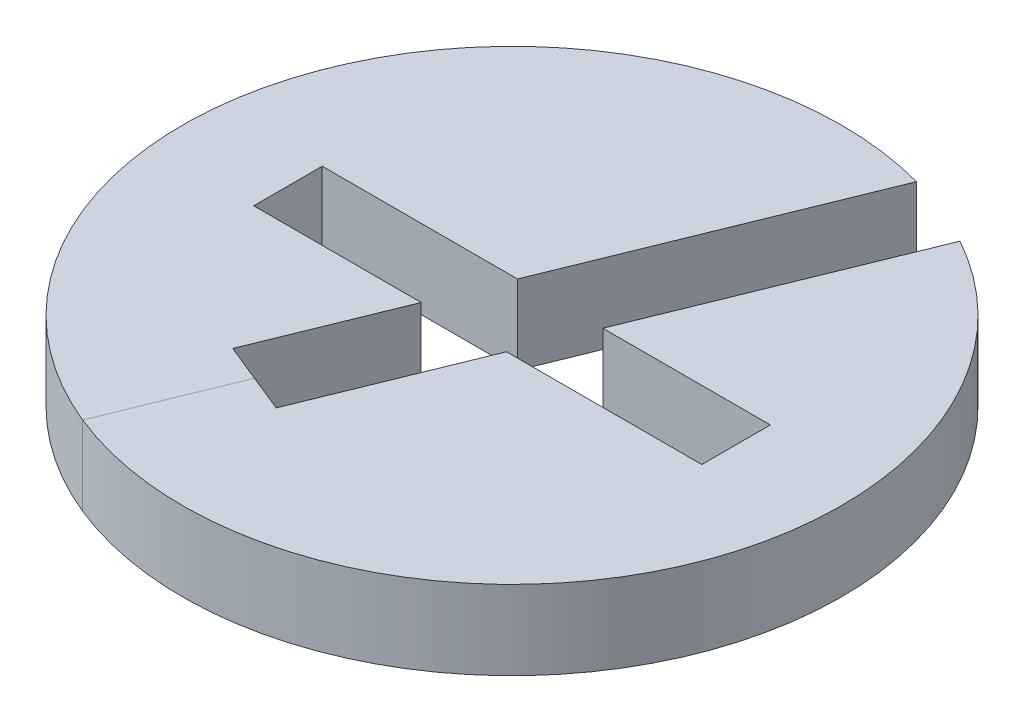
ISO-10303-21;
HEADER;
FILE_DESCRIPTION(('STEP AP214'),'2;1');
FILE_NAME('part.step','',(''),(''),'','','');
FILE_SCHEMA(('AUTOMOTIVE_DESIGN { 1 0 10303 214 1 1 1 1 }'));
ENDSEC;
DATA;
#1=APPLICATION_CONTEXT('core data for automotive mechanical design processes');
#2=APPLICATION_PROTOCOL_DEFINITION('international standard','automotive_design',2000,#1);
#3=PRODUCT_CONTEXT('',#1,'mechanical');
#4=PRODUCT('Part','Part','',(#3));
#5=PRODUCT_RELATED_PRODUCT_CATEGORY('part','',(#4));
#6=PRODUCT_DEFINITION_FORMATION('','',#4);
#7=PRODUCT_DEFINITION_CONTEXT('part definition',#1,'design');
#8=PRODUCT_DEFINITION('design','',#6,#7);
#9=PRODUCT_DEFINITION_SHAPE('','',#8);
#10=(LENGTH_UNIT() NAMED_UNIT(*) SI_UNIT(.MILLI.,.METRE.));
#11=(NAMED_UNIT(*) PLANE_ANGLE_UNIT() SI_UNIT($,.RADIAN.));
#12=(NAMED_UNIT(*) SI_UNIT($,.STERADIAN.) SOLID_ANGLE_UNIT());
#13=UNCERTAINTY_MEASURE_WITH_UNIT(LENGTH_MEASURE(1.E-05),#10,'distance_accuracy_value','');
#14=(GEOMETRIC_REPRESENTATION_CONTEXT(3) GLOBAL_UNCERTAINTY_ASSIGNED_CONTEXT((#13)) GLOBAL_UNIT_ASSIGNED_CONTEXT((#10,
#11,#12)) REPRESENTATION_CONTEXT('',''));
#15=CARTESIAN_POINT('',(0.,0.,0.));
#16=DIRECTION('',(0.,0.,1.));
#17=DIRECTION('',(1.,0.,0.));
#18=AXIS2_PLACEMENT_3D('',#15,#16,#17);
#19=CARTESIAN_POINT('',(0.,0.,0.));
#20=DIRECTION('',(-0.92652863087184,0.,-0.37622426313936));
#21=DIRECTION('',(-0.37622426313936,0.,0.92652863087184));
#22=AXIS2_PLACEMENT_3D('',#19,#20,#21);
#23=PLANE('',#22);
#24=DIRECTION('',(0.,1.,0.));
#25=VECTOR('',#24,1.);
#26=CARTESIAN_POINT('',(-4.702803289242,-1.5,11.581607885898));
#27=LINE('',#26,#25);
#28=CARTESIAN_POINT('',(-4.702803289242,1.5,11.581607885898));
#29=VERTEX_POINT('',#28);
#30=CARTESIAN_POINT('',(-4.702803289242,-1.5,11.581607885898));
#31=VERTEX_POINT('',#30);
#32=EDGE_CURVE('E121',#29,#31,#27,.F.);
#33=ORIENTED_EDGE('',*,*,#32,.F.);
#34=DIRECTION('',(-0.37622426313936,0.,0.92652863087184));
#35=VECTOR('',#34,1.);
#36=CARTESIAN_POINT('',(0.,1.5,0.));
#37=LINE('',#36,#35);
#38=CARTESIAN_POINT('',(-2.8216819735452,1.5,6.9489647315388));
#39=VERTEX_POINT('',#38);
#40=EDGE_CURVE('E109',#39,#29,#37,.T.);
#41=ORIENTED_EDGE('',*,*,#40,.F.);
#42=DIRECTION('',(0.,-1.,0.));
#43=VECTOR('',#42,1.);
#44=CARTESIAN_POINT('',(-2.8216819735452,1.5,6.9489647315388));
#45=LINE('',#44,#43);
#46=CARTESIAN_POINT('',(-2.8216819735452,-1.5,6.9489647315388));
#47=VERTEX_POINT('',#46);
#48=EDGE_CURVE('E119',#39,#47,#45,.T.);
#49=ORIENTED_EDGE('',*,*,#48,.T.);
#50=DIRECTION('',(-0.37622426313936,0.,0.92652863087184));
#51=VECTOR('',#50,1.);
#52=CARTESIAN_POINT('',(0.,-1.5,0.));
#53=LINE('',#52,#51);
#54=EDGE_CURVE('E127',#47,#31,#53,.T.);
#55=ORIENTED_EDGE('',*,*,#54,.T.);
#56=EDGE_LOOP('',(#33,#41,#49,#55));
#57=FACE_BOUND('',#56,.T.);
#58=ADVANCED_FACE('F44',(#57),#23,.T.);
#59=CARTESIAN_POINT('',(0.,-1.5,0.));
#60=DIRECTION('',(0.,1.,0.));
#61=DIRECTION('',(0.,0.,1.));
#62=AXIS2_PLACEMENT_3D('',#59,#60,#61);
#63=CYLINDRICAL_SURFACE('',#62,12.5);
#64=CARTESIAN_POINT('',(0.,1.5,0.));
#65=DIRECTION('',(0.,1.,0.));
#66=DIRECTION('',(0.,0.,1.));
#67=AXIS2_PLACEMENT_3D('',#64,#65,#66);
#68=CIRCLE('',#67,12.5);
#69=CARTESIAN_POINT('',(6.0586132695706,1.5,-10.9335815380772));
#70=VERTEX_POINT('',#69);
#71=EDGE_CURVE('E134',#29,#70,#68,.T.);
#72=ORIENTED_EDGE('',*,*,#71,.F.);
#73=ORIENTED_EDGE('',*,*,#32,.T.);
#74=CARTESIAN_POINT('',(0.,-1.5,0.));
#75=DIRECTION('',(0.,1.,0.));
#76=DIRECTION('',(0.,0.,1.));
#77=AXIS2_PLACEMENT_3D('',#74,#75,#76);
#78=CIRCLE('',#77,12.5);
#79=CARTESIAN_POINT('',(6.0586132695706,-1.5,-10.9335815380772));
#80=VERTEX_POINT('',#79);
#81=EDGE_CURVE('E132',#31,#80,#78,.T.);
#82=ORIENTED_EDGE('',*,*,#81,.T.);
#83=DIRECTION('',(0.,1.,0.));
#84=VECTOR('',#83,1.);
#85=CARTESIAN_POINT('',(6.0586132695706,-1.5,-10.9335815380772));
#86=LINE('',#85,#84);
#87=EDGE_CURVE('E152',#70,#80,#86,.F.);
#88=ORIENTED_EDGE('',*,*,#87,.F.);
#89=EDGE_LOOP('',(#72,#73,#82,#88));
#90=FACE_BOUND('',#89,.T.);
#91=ADVANCED_FACE('F169',(#90),#63,.T.);
#92=CARTESIAN_POINT('',(0.,-1.5,0.));
#93=DIRECTION('',(0.,1.,0.));
#94=DIRECTION('',(0.,0.,1.));
#95=AXIS2_PLACEMENT_3D('',#92,#93,#94);
#96=PLANE('',#95);
#97=ORIENTED_EDGE('',*,*,#54,.F.);
#98=DIRECTION('',(-0.926528630871839,0.,-0.37622426313936));
#99=VECTOR('',#98,1.);
#100=CARTESIAN_POINT('',(-4.21147491985296,-1.5,6.38462833682976));
#101=LINE('',#100,#99);
#102=CARTESIAN_POINT('',(-1.43188902723744,-1.5,7.51330112624784));
#103=VERTEX_POINT('',#102);
#104=EDGE_CURVE('E48',#103,#47,#101,.T.);
#105=ORIENTED_EDGE('',*,*,#104,.F.);
#106=DIRECTION('',(-0.37622426313936,0.,0.92652863087184));
#107=VECTOR('',#106,1.);
#108=CARTESIAN_POINT('',(6.09259623554976,-1.5,-11.017271491189));
#109=LINE('',#108,#107);
#110=CARTESIAN_POINT('',(1.09107093319674,-1.5,1.3));
#111=VERTEX_POINT('',#110);
#112=EDGE_CURVE('E13',#111,#103,#109,.T.);
#113=ORIENTED_EDGE('',*,*,#112,.F.);
#114=DIRECTION('',(-1.,0.,0.));
#115=VECTOR('',#114,1.);
#116=CARTESIAN_POINT('',(-8.5,-1.5,1.3));
#117=LINE('',#116,#115);
#118=CARTESIAN_POINT('',(8.5,-1.5,1.3));
#119=VERTEX_POINT('',#118);
#120=EDGE_CURVE('E145',#119,#111,#117,.T.);
#121=ORIENTED_EDGE('',*,*,#120,.F.);
#122=DIRECTION('',(0.,0.,1.));
#123=VECTOR('',#122,1.);
#124=CARTESIAN_POINT('',(8.5,-1.5,-1.3));
#125=LINE('',#124,#123);
#126=CARTESIAN_POINT('',(8.5,-1.5,-1.3));
#127=VERTEX_POINT('',#126);
#128=EDGE_CURVE('E147',#127,#119,#125,.T.);
#129=ORIENTED_EDGE('',*,*,#128,.F.);
#130=DIRECTION('',(1.,0.,0.));
#131=VECTOR('',#130,1.);
#132=CARTESIAN_POINT('',(-8.5,-1.5,-1.3));
#133=LINE('',#132,#131);
#134=CARTESIAN_POINT('',(2.14682145354697,-1.5,-1.3));
#135=VERTEX_POINT('',#134);
#136=EDGE_CURVE('E143',#135,#127,#133,.T.);
#137=ORIENTED_EDGE('',*,*,#136,.F.);
#138=EDGE_CURVE('E53',#80,#135,#109,.T.);
#139=ORIENTED_EDGE('',*,*,#138,.F.);
#140=ORIENTED_EDGE('',*,*,#81,.F.);
#141=EDGE_LOOP('',(#97,#105,#113,#121,#129,#137,#139,#140));
#142=FACE_BOUND('',#141,.T.);
#143=ADVANCED_FACE('F172',(#142),#96,.F.);
#144=CARTESIAN_POINT('',(0.,1.5,0.));
#145=DIRECTION('',(0.,1.,0.));
#146=DIRECTION('',(0.,0.,1.));
#147=AXIS2_PLACEMENT_3D('',#144,#145,#146);
#148=PLANE('',#147);
#149=DIRECTION('',(-0.926528630871839,0.,-0.37622426313936));
#150=VECTOR('',#149,1.);
#151=CARTESIAN_POINT('',(-4.21147491985296,1.5,6.38462833682976));
#152=LINE('',#151,#150);
#153=CARTESIAN_POINT('',(-1.43188902723744,1.5,7.51330112624784));
#154=VERTEX_POINT('',#153);
#155=EDGE_CURVE('E106',#154,#39,#152,.T.);
#156=ORIENTED_EDGE('',*,*,#155,.T.);
#157=ORIENTED_EDGE('',*,*,#40,.T.);
#158=ORIENTED_EDGE('',*,*,#71,.T.);
#159=DIRECTION('',(-0.37622426313936,0.,0.92652863087184));
#160=VECTOR('',#159,1.);
#161=CARTESIAN_POINT('',(6.09259623554976,1.5,-11.017271491189));
#162=LINE('',#161,#160);
#163=CARTESIAN_POINT('',(2.14682145354697,1.5,-1.3));
#164=VERTEX_POINT('',#163);
#165=EDGE_CURVE('E115',#70,#164,#162,.T.);
#166=ORIENTED_EDGE('',*,*,#165,.T.);
#167=DIRECTION('',(1.,0.,0.));
#168=VECTOR('',#167,1.);
#169=CARTESIAN_POINT('',(-8.5,1.5,-1.3));
#170=LINE('',#169,#168);
#171=CARTESIAN_POINT('',(8.5,1.5,-1.3));
#172=VERTEX_POINT('',#171);
#173=EDGE_CURVE('E137',#164,#172,#170,.T.);
#174=ORIENTED_EDGE('',*,*,#173,.T.);
#175=DIRECTION('',(0.,0.,1.));
#176=VECTOR('',#175,1.);
#177=CARTESIAN_POINT('',(8.5,1.5,-1.3));
#178=LINE('',#177,#176);
#179=CARTESIAN_POINT('',(8.5,1.5,1.3));
#180=VERTEX_POINT('',#179);
#181=EDGE_CURVE('E142',#172,#180,#178,.T.);
#182=ORIENTED_EDGE('',*,*,#181,.T.);
#183=DIRECTION('',(-1.,0.,0.));
#184=VECTOR('',#183,1.);
#185=CARTESIAN_POINT('',(-8.5,1.5,1.3));
#186=LINE('',#185,#184);
#187=CARTESIAN_POINT('',(1.09107093319673,1.5,1.3));
#188=VERTEX_POINT('',#187);
#189=EDGE_CURVE('E139',#180,#188,#186,.T.);
#190=ORIENTED_EDGE('',*,*,#189,.T.);
#191=EDGE_CURVE('E112',#188,#154,#162,.T.);
#192=ORIENTED_EDGE('',*,*,#191,.T.);
#193=EDGE_LOOP('',(#156,#157,#158,#166,#174,#182,#190,#192));
#194=FACE_BOUND('',#193,.T.);
#195=ADVANCED_FACE('F108',(#194),#148,.T.);
#196=CARTESIAN_POINT('',(-4.21147491985296,1.5,6.38462833682976));
#197=DIRECTION('',(-0.37622426313936,0.,0.92652863087184));
#198=DIRECTION('',(0.92652863087184,0.,0.37622426313936));
#199=AXIS2_PLACEMENT_3D('',#196,#197,#198);
#200=PLANE('',#199);
#201=ORIENTED_EDGE('',*,*,#48,.F.);
#202=ORIENTED_EDGE('',*,*,#155,.F.);
#203=DIRECTION('',(0.,-1.,0.));
#204=VECTOR('',#203,1.);
#205=CARTESIAN_POINT('',(-1.43188902723744,1.5,7.51330112624784));
#206=LINE('',#205,#204);
#207=EDGE_CURVE('E63',#154,#103,#206,.T.);
#208=ORIENTED_EDGE('',*,*,#207,.T.);
#209=ORIENTED_EDGE('',*,*,#104,.T.);
#210=EDGE_LOOP('',(#201,#202,#208,#209));
#211=FACE_BOUND('',#210,.T.);
#212=ADVANCED_FACE('F46',(#211),#200,.F.);
#213=CARTESIAN_POINT('',(8.5,1.5,-1.3));
#214=DIRECTION('',(1.,0.,0.));
#215=DIRECTION('',(0.,0.,-1.));
#216=AXIS2_PLACEMENT_3D('',#213,#214,#215);
#217=PLANE('',#216);
#218=ORIENTED_EDGE('',*,*,#128,.T.);
#219=DIRECTION('',(0.,-1.,0.));
#220=VECTOR('',#219,1.);
#221=CARTESIAN_POINT('',(8.5,1.5,1.3));
#222=LINE('',#221,#220);
#223=EDGE_CURVE('E140',#180,#119,#222,.T.);
#224=ORIENTED_EDGE('',*,*,#223,.F.);
#225=ORIENTED_EDGE('',*,*,#181,.F.);
#226=DIRECTION('',(0.,-1.,0.));
#227=VECTOR('',#226,1.);
#228=CARTESIAN_POINT('',(8.5,1.5,-1.3));
#229=LINE('',#228,#227);
#230=EDGE_CURVE('E136',#172,#127,#229,.T.);
#231=ORIENTED_EDGE('',*,*,#230,.T.);
#232=EDGE_LOOP('',(#218,#224,#225,#231));
#233=FACE_BOUND('',#232,.T.);
#234=ADVANCED_FACE('F185',(#233),#217,.F.);
#235=CARTESIAN_POINT('',(-8.5,1.5,-1.3));
#236=DIRECTION('',(0.,0.,-1.));
#237=DIRECTION('',(-1.,0.,0.));
#238=AXIS2_PLACEMENT_3D('',#235,#236,#237);
#239=PLANE('',#238);
#240=ORIENTED_EDGE('',*,*,#173,.F.);
#241=DIRECTION('',(0.,-1.,0.));
#242=VECTOR('',#241,1.);
#243=CARTESIAN_POINT('',(2.14682145354697,1.5,-1.3));
#244=LINE('',#243,#242);
#245=EDGE_CURVE('E158',#164,#135,#244,.T.);
#246=ORIENTED_EDGE('',*,*,#245,.T.);
#247=ORIENTED_EDGE('',*,*,#136,.T.);
#248=ORIENTED_EDGE('',*,*,#230,.F.);
#249=EDGE_LOOP('',(#240,#246,#247,#248));
#250=FACE_BOUND('',#249,.T.);
#251=ADVANCED_FACE('F181',(#250),#239,.F.);
#252=CARTESIAN_POINT('',(-8.5,1.5,1.3));
#253=DIRECTION('',(0.,0.,1.));
#254=DIRECTION('',(1.,0.,0.));
#255=AXIS2_PLACEMENT_3D('',#252,#253,#254);
#256=PLANE('',#255);
#257=ORIENTED_EDGE('',*,*,#120,.T.);
#258=DIRECTION('',(0.,1.,0.));
#259=VECTOR('',#258,1.);
#260=CARTESIAN_POINT('',(1.09107093319673,1.5,1.3));
#261=LINE('',#260,#259);
#262=EDGE_CURVE('E123',#111,#188,#261,.T.);
#263=ORIENTED_EDGE('',*,*,#262,.T.);
#264=ORIENTED_EDGE('',*,*,#189,.F.);
#265=ORIENTED_EDGE('',*,*,#223,.T.);
#266=EDGE_LOOP('',(#257,#263,#264,#265));
#267=FACE_BOUND('',#266,.T.);
#268=ADVANCED_FACE('F186',(#267),#256,.F.);
#269=CARTESIAN_POINT('',(6.09259623554976,1.5,-11.017271491189));
#270=DIRECTION('',(0.92652863087184,0.,0.37622426313936));
#271=DIRECTION('',(0.37622426313936,0.,-0.92652863087184));
#272=AXIS2_PLACEMENT_3D('',#269,#270,#271);
#273=PLANE('',#272);
#274=ORIENTED_EDGE('',*,*,#112,.T.);
#275=ORIENTED_EDGE('',*,*,#207,.F.);
#276=ORIENTED_EDGE('',*,*,#191,.F.);
#277=ORIENTED_EDGE('',*,*,#262,.F.);
#278=EDGE_LOOP('',(#274,#275,#276,#277));
#279=FACE_BOUND('',#278,.T.);
#280=ADVANCED_FACE('F188',(#279),#273,.F.);
#281=ORIENTED_EDGE('',*,*,#87,.T.);
#282=ORIENTED_EDGE('',*,*,#138,.T.);
#283=ORIENTED_EDGE('',*,*,#245,.F.);
#284=ORIENTED_EDGE('',*,*,#165,.F.);
#285=EDGE_LOOP('',(#281,#282,#283,#284));
#286=FACE_BOUND('',#285,.T.);
#287=ADVANCED_FACE('F176',(#286),#273,.F.);
#288=CLOSED_SHELL('',(#58,#91,#143,#195,#212,#234,#251,#268,#280,#287));
#289=MANIFOLD_SOLID_BREP('B2',#288);
#290=CARTESIAN_POINT('',(0.,0.,0.));
#291=DIRECTION('',(-0.92652863087184,0.,-0.37622426313936));
#292=DIRECTION('',(-0.37622426313936,0.,0.92652863087184));
#293=AXIS2_PLACEMENT_3D('',#290,#291,#292);
#294=PLANE('',#293);
#295=DIRECTION('',(0.,1.,0.));
#296=VECTOR('',#295,1.);
#297=CARTESIAN_POINT('',(-4.702803289242,-1.5,11.581607885898));
#298=LINE('',#297,#296);
#299=CARTESIAN_POINT('',(-4.702803289242,1.5,11.581607885898));
#300=VERTEX_POINT('',#299);
#301=CARTESIAN_POINT('',(-4.702803289242,-1.5,11.581607885898));
#302=VERTEX_POINT('',#301);
#303=EDGE_CURVE('E272',#300,#302,#298,.F.);
#304=ORIENTED_EDGE('',*,*,#303,.T.);
#305=DIRECTION('',(-0.37622426313936,0.,0.92652863087184));
#306=VECTOR('',#305,1.);
#307=CARTESIAN_POINT('',(0.,-1.5,0.));
#308=LINE('',#307,#306);
#309=CARTESIAN_POINT('',(-2.8216819735452,-1.5,6.9489647315388));
#310=VERTEX_POINT('',#309);
#311=EDGE_CURVE('E290',#310,#302,#308,.T.);
#312=ORIENTED_EDGE('',*,*,#311,.F.);
#313=DIRECTION('',(0.,-1.,0.));
#314=VECTOR('',#313,1.);
#315=CARTESIAN_POINT('',(-2.8216819735452,1.5,6.9489647315388));
#316=LINE('',#315,#314);
#317=CARTESIAN_POINT('',(-2.8216819735452,1.5,6.9489647315388));
#318=VERTEX_POINT('',#317);
#319=EDGE_CURVE('E339',#318,#310,#316,.T.);
#320=ORIENTED_EDGE('',*,*,#319,.F.);
#321=DIRECTION('',(-0.37622426313936,0.,0.92652863087184));
#322=VECTOR('',#321,1.);
#323=CARTESIAN_POINT('',(0.,1.5,0.));
#324=LINE('',#323,#322);
#325=EDGE_CURVE('E42',#318,#300,#324,.T.);
#326=ORIENTED_EDGE('',*,*,#325,.T.);
#327=EDGE_LOOP('',(#304,#312,#320,#326));
#328=FACE_BOUND('',#327,.T.);
#329=ADVANCED_FACE('F269',(#328),#294,.F.);
#330=CARTESIAN_POINT('',(0.,-1.5,0.));
#331=DIRECTION('',(0.,1.,0.));
#332=DIRECTION('',(0.,0.,1.));
#333=AXIS2_PLACEMENT_3D('',#330,#331,#332);
#334=CYLINDRICAL_SURFACE('',#333,12.5);
#335=ORIENTED_EDGE('',*,*,#303,.F.);
#336=CARTESIAN_POINT('',(0.,1.5,0.));
#337=DIRECTION('',(0.,1.,0.));
#338=DIRECTION('',(0.,0.,1.));
#339=AXIS2_PLACEMENT_3D('',#336,#337,#338);
#340=CIRCLE('',#339,12.5);
#341=CARTESIAN_POINT('',(3.27902737695509,1.5,-12.0622543274953));
#342=VERTEX_POINT('',#341);
#343=EDGE_CURVE('E383',#342,#300,#340,.T.);
#344=ORIENTED_EDGE('',*,*,#343,.F.);
#345=DIRECTION('',(0.,1.,0.));
#346=VECTOR('',#345,1.);
#347=CARTESIAN_POINT('',(3.27902737695509,-1.5,-12.0622543274953));
#348=LINE('',#347,#346);
#349=CARTESIAN_POINT('',(3.27902737695509,-1.5,-12.0622543274953));
#350=VERTEX_POINT('',#349);
#351=EDGE_CURVE('E363',#350,#342,#348,.T.);
#352=ORIENTED_EDGE('',*,*,#351,.F.);
#353=CARTESIAN_POINT('',(0.,-1.5,0.));
#354=DIRECTION('',(0.,1.,0.));
#355=DIRECTION('',(0.,0.,1.));
#356=AXIS2_PLACEMENT_3D('',#353,#354,#355);
#357=CIRCLE('',#356,12.5);
#358=EDGE_CURVE('E388',#350,#302,#357,.T.);
#359=ORIENTED_EDGE('',*,*,#358,.T.);
#360=EDGE_LOOP('',(#335,#344,#352,#359));
#361=FACE_BOUND('',#360,.T.);
#362=ADVANCED_FACE('F396',(#361),#334,.T.);
#363=CARTESIAN_POINT('',(3.31301034293424,1.5,-12.145944280607));
#364=DIRECTION('',(-0.92652863087184,0.,-0.37622426313936));
#365=DIRECTION('',(-0.37622426313936,0.,0.92652863087184));
#366=AXIS2_PLACEMENT_3D('',#363,#364,#365);
#367=PLANE('',#366);
#368=ORIENTED_EDGE('',*,*,#351,.T.);
#369=DIRECTION('',(0.37622426313936,0.,-0.92652863087184));
#370=VECTOR('',#369,1.);
#371=CARTESIAN_POINT('',(3.31301034293424,1.5,-12.145944280607));
#372=LINE('',#371,#370);
#373=CARTESIAN_POINT('',(-1.09107093319674,1.5,-1.3));
#374=VERTEX_POINT('',#373);
#375=EDGE_CURVE('E357',#374,#342,#372,.T.);
#376=ORIENTED_EDGE('',*,*,#375,.F.);
#377=DIRECTION('',(0.,1.,0.));
#378=VECTOR('',#377,1.);
#379=CARTESIAN_POINT('',(-1.09107093319674,1.5,-1.3));
#380=LINE('',#379,#378);
#381=CARTESIAN_POINT('',(-1.09107093319674,-1.5,-1.3));
#382=VERTEX_POINT('',#381);
#383=EDGE_CURVE('E349',#382,#374,#380,.T.);
#384=ORIENTED_EDGE('',*,*,#383,.F.);
#385=DIRECTION('',(0.37622426313936,0.,-0.92652863087184));
#386=VECTOR('',#385,1.);
#387=CARTESIAN_POINT('',(3.31301034293424,-1.5,-12.145944280607));
#388=LINE('',#387,#386);
#389=EDGE_CURVE('E341',#382,#350,#388,.T.);
#390=ORIENTED_EDGE('',*,*,#389,.T.);
#391=EDGE_LOOP('',(#368,#376,#384,#390));
#392=FACE_BOUND('',#391,.T.);
#393=ADVANCED_FACE('F413',(#392),#367,.F.);
#394=CARTESIAN_POINT('',(-8.5,1.5,-1.3));
#395=DIRECTION('',(0.,0.,-1.));
#396=DIRECTION('',(-1.,0.,0.));
#397=AXIS2_PLACEMENT_3D('',#394,#395,#396);
#398=PLANE('',#397);
#399=DIRECTION('',(1.,0.,0.));
#400=VECTOR('',#399,1.);
#401=CARTESIAN_POINT('',(-8.5,-1.5,-1.3));
#402=LINE('',#401,#400);
#403=CARTESIAN_POINT('',(-8.5,-1.5,-1.3));
#404=VERTEX_POINT('',#403);
#405=EDGE_CURVE('E368',#404,#382,#402,.T.);
#406=ORIENTED_EDGE('',*,*,#405,.T.);
#407=ORIENTED_EDGE('',*,*,#383,.T.);
#408=DIRECTION('',(1.,0.,0.));
#409=VECTOR('',#408,1.);
#410=CARTESIAN_POINT('',(-8.5,1.5,-1.3));
#411=LINE('',#410,#409);
#412=CARTESIAN_POINT('',(-8.5,1.5,-1.3));
#413=VERTEX_POINT('',#412);
#414=EDGE_CURVE('E371',#413,#374,#411,.T.);
#415=ORIENTED_EDGE('',*,*,#414,.F.);
#416=DIRECTION('',(0.,-1.,0.));
#417=VECTOR('',#416,1.);
#418=CARTESIAN_POINT('',(-8.5,1.5,-1.3));
#419=LINE('',#418,#417);
#420=EDGE_CURVE('E381',#413,#404,#419,.T.);
#421=ORIENTED_EDGE('',*,*,#420,.T.);
#422=EDGE_LOOP('',(#406,#407,#415,#421));
#423=FACE_BOUND('',#422,.T.);
#424=ADVANCED_FACE('F401',(#423),#398,.F.);
#425=CARTESIAN_POINT('',(-8.5,1.5,-1.3));
#426=DIRECTION('',(-1.,0.,0.));
#427=DIRECTION('',(0.,0.,1.));
#428=AXIS2_PLACEMENT_3D('',#425,#426,#427);
#429=PLANE('',#428);
#430=DIRECTION('',(0.,0.,-1.));
#431=VECTOR('',#430,1.);
#432=CARTESIAN_POINT('',(-8.5,-1.5,-1.3));
#433=LINE('',#432,#431);
#434=CARTESIAN_POINT('',(-8.5,-1.5,1.3));
#435=VERTEX_POINT('',#434);
#436=EDGE_CURVE('E376',#435,#404,#433,.T.);
#437=ORIENTED_EDGE('',*,*,#436,.T.);
#438=ORIENTED_EDGE('',*,*,#420,.F.);
#439=DIRECTION('',(0.,0.,-1.));
#440=VECTOR('',#439,1.);
#441=CARTESIAN_POINT('',(-8.5,1.5,-1.3));
#442=LINE('',#441,#440);
#443=CARTESIAN_POINT('',(-8.5,1.5,1.3));
#444=VERTEX_POINT('',#443);
#445=EDGE_CURVE('E367',#444,#413,#442,.T.);
#446=ORIENTED_EDGE('',*,*,#445,.F.);
#447=DIRECTION('',(0.,-1.,0.));
#448=VECTOR('',#447,1.);
#449=CARTESIAN_POINT('',(-8.5,1.5,1.3));
#450=LINE('',#449,#448);
#451=EDGE_CURVE('E374',#444,#435,#450,.T.);
#452=ORIENTED_EDGE('',*,*,#451,.T.);
#453=EDGE_LOOP('',(#437,#438,#446,#452));
#454=FACE_BOUND('',#453,.T.);
#455=ADVANCED_FACE('F405',(#454),#429,.F.);
#456=CARTESIAN_POINT('',(-8.5,1.5,1.3));
#457=DIRECTION('',(0.,0.,1.));
#458=DIRECTION('',(1.,0.,0.));
#459=AXIS2_PLACEMENT_3D('',#456,#457,#458);
#460=PLANE('',#459);
#461=DIRECTION('',(-1.,0.,0.));
#462=VECTOR('',#461,1.);
#463=CARTESIAN_POINT('',(-8.5,1.5,1.3));
#464=LINE('',#463,#462);
#465=CARTESIAN_POINT('',(-2.14682145354697,1.5,1.3));
#466=VERTEX_POINT('',#465);
#467=EDGE_CURVE('E365',#466,#444,#464,.T.);
#468=ORIENTED_EDGE('',*,*,#467,.F.);
#469=DIRECTION('',(0.,-1.,0.));
#470=VECTOR('',#469,1.);
#471=CARTESIAN_POINT('',(-2.14682145354697,1.5,1.3));
#472=LINE('',#471,#470);
#473=CARTESIAN_POINT('',(-2.14682145354697,-1.5,1.3));
#474=VERTEX_POINT('',#473);
#475=EDGE_CURVE('E391',#466,#474,#472,.T.);
#476=ORIENTED_EDGE('',*,*,#475,.T.);
#477=DIRECTION('',(-1.,0.,0.));
#478=VECTOR('',#477,1.);
#479=CARTESIAN_POINT('',(-8.5,-1.5,1.3));
#480=LINE('',#479,#478);
#481=EDGE_CURVE('E354',#474,#435,#480,.T.);
#482=ORIENTED_EDGE('',*,*,#481,.T.);
#483=ORIENTED_EDGE('',*,*,#451,.F.);
#484=EDGE_LOOP('',(#468,#476,#482,#483));
#485=FACE_BOUND('',#484,.T.);
#486=ADVANCED_FACE('F409',(#485),#460,.F.);
#487=CARTESIAN_POINT('',(-4.21147491985296,1.5,6.38462833682976));
#488=VERTEX_POINT('',#487);
#489=EDGE_CURVE('E348',#488,#466,#372,.T.);
#490=ORIENTED_EDGE('',*,*,#489,.F.);
#491=DIRECTION('',(0.,-1.,0.));
#492=VECTOR('',#491,1.);
#493=CARTESIAN_POINT('',(-4.21147491985296,1.5,6.38462833682976));
#494=LINE('',#493,#492);
#495=CARTESIAN_POINT('',(-4.21147491985296,-1.5,6.38462833682976));
#496=VERTEX_POINT('',#495);
#497=EDGE_CURVE('E337',#488,#496,#494,.T.);
#498=ORIENTED_EDGE('',*,*,#497,.T.);
#499=EDGE_CURVE('E345',#496,#474,#388,.T.);
#500=ORIENTED_EDGE('',*,*,#499,.T.);
#501=ORIENTED_EDGE('',*,*,#475,.F.);
#502=EDGE_LOOP('',(#490,#498,#500,#501));
#503=FACE_BOUND('',#502,.T.);
#504=ADVANCED_FACE('F344',(#503),#367,.F.);
#505=CARTESIAN_POINT('',(0.,-1.5,0.));
#506=DIRECTION('',(0.,1.,0.));
#507=DIRECTION('',(0.,0.,1.));
#508=AXIS2_PLACEMENT_3D('',#505,#506,#507);
#509=PLANE('',#508);
#510=DIRECTION('',(-0.926528630871839,0.,-0.37622426313936));
#511=VECTOR('',#510,1.);
#512=CARTESIAN_POINT('',(-4.21147491985296,-1.5,6.38462833682976));
#513=LINE('',#512,#511);
#514=EDGE_CURVE('E333',#310,#496,#513,.T.);
#515=ORIENTED_EDGE('',*,*,#514,.F.);
#516=ORIENTED_EDGE('',*,*,#311,.T.);
#517=ORIENTED_EDGE('',*,*,#358,.F.);
#518=ORIENTED_EDGE('',*,*,#389,.F.);
#519=ORIENTED_EDGE('',*,*,#405,.F.);
#520=ORIENTED_EDGE('',*,*,#436,.F.);
#521=ORIENTED_EDGE('',*,*,#481,.F.);
#522=ORIENTED_EDGE('',*,*,#499,.F.);
#523=EDGE_LOOP('',(#515,#516,#517,#518,#519,#520,#521,#522));
#524=FACE_BOUND('',#523,.T.);
#525=ADVANCED_FACE('F352',(#524),#509,.F.);
#526=CARTESIAN_POINT('',(0.,1.5,0.));
#527=DIRECTION('',(0.,1.,0.));
#528=DIRECTION('',(0.,0.,1.));
#529=AXIS2_PLACEMENT_3D('',#526,#527,#528);
#530=PLANE('',#529);
#531=ORIENTED_EDGE('',*,*,#325,.F.);
#532=DIRECTION('',(-0.926528630871839,0.,-0.37622426313936));
#533=VECTOR('',#532,1.);
#534=CARTESIAN_POINT('',(-4.21147491985296,1.5,6.38462833682976));
#535=LINE('',#534,#533);
#536=EDGE_CURVE('E355',#318,#488,#535,.T.);
#537=ORIENTED_EDGE('',*,*,#536,.T.);
#538=ORIENTED_EDGE('',*,*,#489,.T.);
#539=ORIENTED_EDGE('',*,*,#467,.T.);
#540=ORIENTED_EDGE('',*,*,#445,.T.);
#541=ORIENTED_EDGE('',*,*,#414,.T.);
#542=ORIENTED_EDGE('',*,*,#375,.T.);
#543=ORIENTED_EDGE('',*,*,#343,.T.);
#544=EDGE_LOOP('',(#531,#537,#538,#539,#540,#541,#542,#543));
#545=FACE_BOUND('',#544,.T.);
#546=ADVANCED_FACE('F411',(#545),#530,.T.);
#547=CARTESIAN_POINT('',(-4.21147491985296,1.5,6.38462833682976));
#548=DIRECTION('',(-0.37622426313936,0.,0.92652863087184));
#549=DIRECTION('',(0.92652863087184,0.,0.37622426313936));
#550=AXIS2_PLACEMENT_3D('',#547,#548,#549);
#551=PLANE('',#550);
#552=ORIENTED_EDGE('',*,*,#536,.F.);
#553=ORIENTED_EDGE('',*,*,#319,.T.);
#554=ORIENTED_EDGE('',*,*,#514,.T.);
#555=ORIENTED_EDGE('',*,*,#497,.F.);
#556=EDGE_LOOP('',(#552,#553,#554,#555));
#557=FACE_BOUND('',#556,.T.);
#558=ADVANCED_FACE('F336',(#557),#551,.F.);
#559=CLOSED_SHELL('',(#329,#362,#393,#424,#455,#486,#504,#525,#546,#558));
#560=MANIFOLD_SOLID_BREP('B7',#559);
#561=ADVANCED_BREP_SHAPE_REPRESENTATION('',(#18,#289,#560),#14);
#562=SHAPE_DEFINITION_REPRESENTATION(#9,#561);
ENDSEC;
END-ISO-10303-21;
